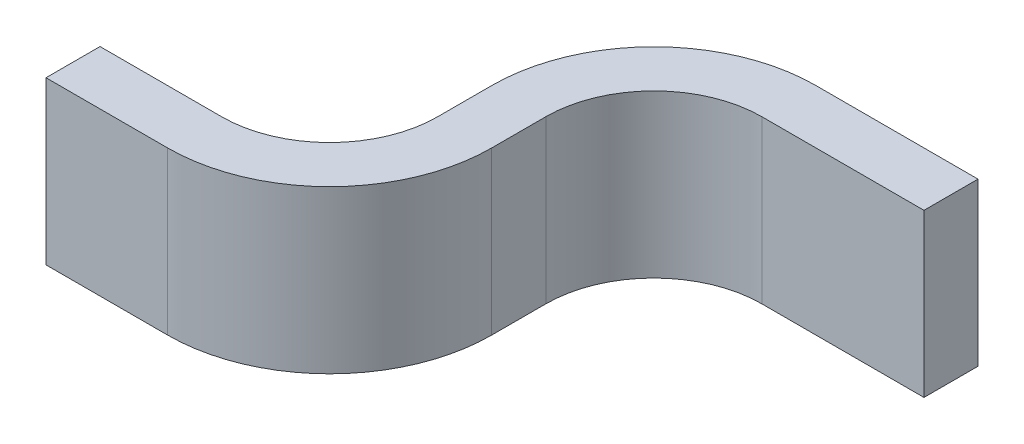
ISO-10303-21;
HEADER;
FILE_DESCRIPTION(('STEP AP214'),'2;1');
FILE_NAME('part.step','',(''),(''),'','','');
FILE_SCHEMA(('AUTOMOTIVE_DESIGN { 1 0 10303 214 1 1 1 1 }'));
ENDSEC;
DATA;
#1=APPLICATION_CONTEXT('core data for automotive mechanical design processes');
#2=APPLICATION_PROTOCOL_DEFINITION('international standard','automotive_design',2000,#1);
#3=PRODUCT_CONTEXT('',#1,'mechanical');
#4=PRODUCT('Part','Part','',(#3));
#5=PRODUCT_RELATED_PRODUCT_CATEGORY('part','',(#4));
#6=PRODUCT_DEFINITION_FORMATION('','',#4);
#7=PRODUCT_DEFINITION_CONTEXT('part definition',#1,'design');
#8=PRODUCT_DEFINITION('design','',#6,#7);
#9=PRODUCT_DEFINITION_SHAPE('','',#8);
#10=(LENGTH_UNIT() NAMED_UNIT(*) SI_UNIT(.MILLI.,.METRE.));
#11=(NAMED_UNIT(*) PLANE_ANGLE_UNIT() SI_UNIT($,.RADIAN.));
#12=(NAMED_UNIT(*) SI_UNIT($,.STERADIAN.) SOLID_ANGLE_UNIT());
#13=UNCERTAINTY_MEASURE_WITH_UNIT(LENGTH_MEASURE(1.E-05),#10,'distance_accuracy_value','');
#14=(GEOMETRIC_REPRESENTATION_CONTEXT(3) GLOBAL_UNCERTAINTY_ASSIGNED_CONTEXT((#13)) GLOBAL_UNIT_ASSIGNED_CONTEXT((#10,
#11,#12)) REPRESENTATION_CONTEXT('',''));
#15=CARTESIAN_POINT('',(0.,0.,0.));
#16=DIRECTION('',(0.,0.,1.));
#17=DIRECTION('',(1.,0.,0.));
#18=AXIS2_PLACEMENT_3D('',#15,#16,#17);
#19=CARTESIAN_POINT('',(15.475,57.010000024,2.313254));
#20=DIRECTION('',(-1.,0.,0.));
#21=DIRECTION('',(0.,-1.,0.));
#22=AXIS2_PLACEMENT_3D('',#19,#20,#21);
#23=PLANE('',#22);
#24=DIRECTION('',(0.,0.,1.));
#25=VECTOR('',#24,1.);
#26=CARTESIAN_POINT('',(15.475,64.385000024,2.713254));
#27=LINE('',#26,#25);
#28=CARTESIAN_POINT('',(15.475,64.385000024,2.413254));
#29=VERTEX_POINT('',#28);
#30=CARTESIAN_POINT('',(15.475,64.385000024,2.313254));
#31=VERTEX_POINT('',#30);
#32=EDGE_CURVE('E139',#29,#31,#27,.F.);
#33=ORIENTED_EDGE('',*,*,#32,.T.);
#34=DIRECTION('',(0.,-1.,0.));
#35=VECTOR('',#34,1.);
#36=CARTESIAN_POINT('',(15.475,57.010000024,2.313254));
#37=LINE('',#36,#35);
#38=CARTESIAN_POINT('',(15.475,64.685000024,2.313254));
#39=VERTEX_POINT('',#38);
#40=EDGE_CURVE('E153',#31,#39,#37,.F.);
#41=ORIENTED_EDGE('',*,*,#40,.T.);
#42=DIRECTION('',(0.,0.,1.));
#43=VECTOR('',#42,1.);
#44=CARTESIAN_POINT('',(15.475,64.685000024,2.713254));
#45=LINE('',#44,#43);
#46=CARTESIAN_POINT('',(15.475,64.685000024,2.413254));
#47=VERTEX_POINT('',#46);
#48=EDGE_CURVE('E207',#39,#47,#45,.T.);
#49=ORIENTED_EDGE('',*,*,#48,.T.);
#50=DIRECTION('',(0.,-1.,0.));
#51=VECTOR('',#50,1.);
#52=CARTESIAN_POINT('',(15.475,57.010000024,2.413254));
#53=LINE('',#52,#51);
#54=EDGE_CURVE('E187',#29,#47,#53,.F.);
#55=ORIENTED_EDGE('',*,*,#54,.F.);
#56=EDGE_LOOP('',(#33,#41,#49,#55));
#57=FACE_BOUND('',#56,.T.);
#58=ADVANCED_FACE('F17',(#57),#23,.F.);
#59=CARTESIAN_POINT('',(15.175,57.010000024,2.413254));
#60=DIRECTION('',(0.,-1.,0.));
#61=DIRECTION('',(1.,0.,0.));
#62=AXIS2_PLACEMENT_3D('',#59,#60,#61);
#63=CYLINDRICAL_SURFACE('',#62,0.3);
#64=ORIENTED_EDGE('',*,*,#54,.T.);
#65=CARTESIAN_POINT('',(15.175,64.685000024,2.413254));
#66=DIRECTION('',(0.,-1.,0.));
#67=DIRECTION('',(1.,0.,0.));
#68=AXIS2_PLACEMENT_3D('',#65,#66,#67);
#69=CIRCLE('',#68,0.3);
#70=CARTESIAN_POINT('',(15.175,64.685000024,2.713254));
#71=VERTEX_POINT('',#70);
#72=EDGE_CURVE('E205',#47,#71,#69,.T.);
#73=ORIENTED_EDGE('',*,*,#72,.T.);
#74=DIRECTION('',(0.,1.,0.));
#75=VECTOR('',#74,1.);
#76=CARTESIAN_POINT('',(15.175,64.685000024,2.713254));
#77=LINE('',#76,#75);
#78=CARTESIAN_POINT('',(15.175,64.385000024,2.713254));
#79=VERTEX_POINT('',#78);
#80=EDGE_CURVE('E122',#71,#79,#77,.F.);
#81=ORIENTED_EDGE('',*,*,#80,.T.);
#82=CARTESIAN_POINT('',(15.175,64.385000024,2.413254));
#83=DIRECTION('',(0.,-1.,0.));
#84=DIRECTION('',(1.,0.,0.));
#85=AXIS2_PLACEMENT_3D('',#82,#83,#84);
#86=CIRCLE('',#85,0.3);
#87=EDGE_CURVE('E137',#79,#29,#86,.F.);
#88=ORIENTED_EDGE('',*,*,#87,.T.);
#89=EDGE_LOOP('',(#64,#73,#81,#88));
#90=FACE_BOUND('',#89,.T.);
#91=ADVANCED_FACE('F362',(#90),#63,.T.);
#92=CARTESIAN_POINT('',(15.975,64.685000024,2.713254));
#93=DIRECTION('',(0.,0.,-1.));
#94=DIRECTION('',(-1.,0.,0.));
#95=AXIS2_PLACEMENT_3D('',#92,#93,#94);
#96=PLANE('',#95);
#97=DIRECTION('',(1.,0.,0.));
#98=VECTOR('',#97,1.);
#99=CARTESIAN_POINT('',(14.95,64.685000024,2.713254));
#100=LINE('',#99,#98);
#101=CARTESIAN_POINT('',(14.95,64.685000024,2.713254));
#102=VERTEX_POINT('',#101);
#103=EDGE_CURVE('E118',#71,#102,#100,.F.);
#104=ORIENTED_EDGE('',*,*,#103,.T.);
#105=DIRECTION('',(0.,1.,0.));
#106=VECTOR('',#105,1.);
#107=CARTESIAN_POINT('',(14.95,64.685000024,2.713254));
#108=LINE('',#107,#106);
#109=CARTESIAN_POINT('',(14.95,64.385000024,2.713254));
#110=VERTEX_POINT('',#109);
#111=EDGE_CURVE('E110',#102,#110,#108,.F.);
#112=ORIENTED_EDGE('',*,*,#111,.T.);
#113=DIRECTION('',(-1.,0.,0.));
#114=VECTOR('',#113,1.);
#115=CARTESIAN_POINT('',(14.95,64.385000024,2.713254));
#116=LINE('',#115,#114);
#117=EDGE_CURVE('E115',#110,#79,#116,.F.);
#118=ORIENTED_EDGE('',*,*,#117,.T.);
#119=ORIENTED_EDGE('',*,*,#80,.F.);
#120=EDGE_LOOP('',(#104,#112,#118,#119));
#121=FACE_BOUND('',#120,.T.);
#122=ADVANCED_FACE('F112',(#121),#96,.F.);
#123=CARTESIAN_POINT('',(14.95,64.685000024,2.713254));
#124=DIRECTION('',(1.,0.,0.));
#125=DIRECTION('',(0.,1.,0.));
#126=AXIS2_PLACEMENT_3D('',#123,#124,#125);
#127=PLANE('',#126);
#128=DIRECTION('',(0.,1.,0.));
#129=VECTOR('',#128,1.);
#130=CARTESIAN_POINT('',(14.95,57.010000024,2.613254));
#131=LINE('',#130,#129);
#132=CARTESIAN_POINT('',(14.95,64.685000024,2.613254));
#133=VERTEX_POINT('',#132);
#134=CARTESIAN_POINT('',(14.95,64.385000024,2.613254));
#135=VERTEX_POINT('',#134);
#136=EDGE_CURVE('E121',#133,#135,#131,.F.);
#137=ORIENTED_EDGE('',*,*,#136,.T.);
#138=DIRECTION('',(0.,0.,1.));
#139=VECTOR('',#138,1.);
#140=CARTESIAN_POINT('',(14.95,64.385000024,2.713254));
#141=LINE('',#140,#139);
#142=EDGE_CURVE('E125',#135,#110,#141,.T.);
#143=ORIENTED_EDGE('',*,*,#142,.T.);
#144=ORIENTED_EDGE('',*,*,#111,.F.);
#145=DIRECTION('',(0.,0.,1.));
#146=VECTOR('',#145,1.);
#147=CARTESIAN_POINT('',(14.95,64.685000024,2.713254));
#148=LINE('',#147,#146);
#149=EDGE_CURVE('E179',#102,#133,#148,.F.);
#150=ORIENTED_EDGE('',*,*,#149,.T.);
#151=EDGE_LOOP('',(#137,#143,#144,#150));
#152=FACE_BOUND('',#151,.T.);
#153=ADVANCED_FACE('F126',(#152),#127,.F.);
#154=CARTESIAN_POINT('',(15.175,57.010000024,2.613254));
#155=DIRECTION('',(0.,0.,1.));
#156=DIRECTION('',(1.,0.,0.));
#157=AXIS2_PLACEMENT_3D('',#154,#155,#156);
#158=PLANE('',#157);
#159=DIRECTION('',(-1.,0.,0.));
#160=VECTOR('',#159,1.);
#161=CARTESIAN_POINT('',(14.95,64.385000024,2.613254));
#162=LINE('',#161,#160);
#163=CARTESIAN_POINT('',(15.175,64.385000024,2.613254));
#164=VERTEX_POINT('',#163);
#165=EDGE_CURVE('E131',#164,#135,#162,.T.);
#166=ORIENTED_EDGE('',*,*,#165,.T.);
#167=ORIENTED_EDGE('',*,*,#136,.F.);
#168=DIRECTION('',(1.,0.,0.));
#169=VECTOR('',#168,1.);
#170=CARTESIAN_POINT('',(14.95,64.685000024,2.613254));
#171=LINE('',#170,#169);
#172=CARTESIAN_POINT('',(15.175,64.685000024,2.613254));
#173=VERTEX_POINT('',#172);
#174=EDGE_CURVE('E181',#133,#173,#171,.T.);
#175=ORIENTED_EDGE('',*,*,#174,.T.);
#176=DIRECTION('',(0.,-1.,0.));
#177=VECTOR('',#176,1.);
#178=CARTESIAN_POINT('',(15.175,57.010000024,2.613254));
#179=LINE('',#178,#177);
#180=EDGE_CURVE('E158',#173,#164,#179,.T.);
#181=ORIENTED_EDGE('',*,*,#180,.T.);
#182=EDGE_LOOP('',(#166,#167,#175,#181));
#183=FACE_BOUND('',#182,.T.);
#184=ADVANCED_FACE('F258',(#183),#158,.F.);
#185=CARTESIAN_POINT('',(15.175,57.010000024,2.413254));
#186=DIRECTION('',(0.,-1.,0.));
#187=DIRECTION('',(1.,0.,0.));
#188=AXIS2_PLACEMENT_3D('',#185,#186,#187);
#189=CYLINDRICAL_SURFACE('',#188,0.2);
#190=CARTESIAN_POINT('',(15.175,64.385000024,2.413254));
#191=DIRECTION('',(0.,-1.,0.));
#192=DIRECTION('',(1.,0.,0.));
#193=AXIS2_PLACEMENT_3D('',#190,#191,#192);
#194=CIRCLE('',#193,0.2);
#195=CARTESIAN_POINT('',(15.375,64.385000024,2.41325399999999));
#196=VERTEX_POINT('',#195);
#197=EDGE_CURVE('E20',#196,#164,#194,.T.);
#198=ORIENTED_EDGE('',*,*,#197,.T.);
#199=ORIENTED_EDGE('',*,*,#180,.F.);
#200=CARTESIAN_POINT('',(15.175,64.685000024,2.413254));
#201=DIRECTION('',(0.,-1.,0.));
#202=DIRECTION('',(1.,0.,0.));
#203=AXIS2_PLACEMENT_3D('',#200,#201,#202);
#204=CIRCLE('',#203,0.2);
#205=CARTESIAN_POINT('',(15.375,64.685000024,2.41325399999999));
#206=VERTEX_POINT('',#205);
#207=EDGE_CURVE('E203',#173,#206,#204,.F.);
#208=ORIENTED_EDGE('',*,*,#207,.T.);
#209=DIRECTION('',(0.,1.,0.));
#210=VECTOR('',#209,1.);
#211=CARTESIAN_POINT('',(15.375,57.010000024,2.41325399999999));
#212=LINE('',#211,#210);
#213=EDGE_CURVE('E87',#206,#196,#212,.F.);
#214=ORIENTED_EDGE('',*,*,#213,.T.);
#215=EDGE_LOOP('',(#198,#199,#208,#214));
#216=FACE_BOUND('',#215,.T.);
#217=ADVANCED_FACE('F260',(#216),#189,.F.);
#218=CARTESIAN_POINT('',(15.975,64.685000024,2.713254));
#219=DIRECTION('',(-1.,0.,0.));
#220=DIRECTION('',(0.,-1.,0.));
#221=AXIS2_PLACEMENT_3D('',#218,#219,#220);
#222=PLANE('',#221);
#223=DIRECTION('',(0.,1.,0.));
#224=VECTOR('',#223,1.);
#225=CARTESIAN_POINT('',(15.975,57.010000024,2.113254));
#226=LINE('',#225,#224);
#227=CARTESIAN_POINT('',(15.975,64.685000024,2.113254));
#228=VERTEX_POINT('',#227);
#229=CARTESIAN_POINT('',(15.975,64.385000024,2.113254));
#230=VERTEX_POINT('',#229);
#231=EDGE_CURVE('E95',#228,#230,#226,.F.);
#232=ORIENTED_EDGE('',*,*,#231,.T.);
#233=DIRECTION('',(0.,0.,1.));
#234=VECTOR('',#233,1.);
#235=CARTESIAN_POINT('',(15.975,64.385000024,2.713254));
#236=LINE('',#235,#234);
#237=CARTESIAN_POINT('',(15.975,64.385000024,2.013254));
#238=VERTEX_POINT('',#237);
#239=EDGE_CURVE('E173',#230,#238,#236,.F.);
#240=ORIENTED_EDGE('',*,*,#239,.T.);
#241=DIRECTION('',(0.,1.,0.));
#242=VECTOR('',#241,1.);
#243=CARTESIAN_POINT('',(15.975,64.685000024,2.013254));
#244=LINE('',#243,#242);
#245=CARTESIAN_POINT('',(15.975,64.685000024,2.013254));
#246=VERTEX_POINT('',#245);
#247=EDGE_CURVE('E150',#246,#238,#244,.F.);
#248=ORIENTED_EDGE('',*,*,#247,.F.);
#249=DIRECTION('',(0.,0.,1.));
#250=VECTOR('',#249,1.);
#251=CARTESIAN_POINT('',(15.975,64.685000024,2.713254));
#252=LINE('',#251,#250);
#253=EDGE_CURVE('E161',#246,#228,#252,.T.);
#254=ORIENTED_EDGE('',*,*,#253,.T.);
#255=EDGE_LOOP('',(#232,#240,#248,#254));
#256=FACE_BOUND('',#255,.T.);
#257=ADVANCED_FACE('F321',(#256),#222,.F.);
#258=CARTESIAN_POINT('',(15.675,57.010000024,2.113254));
#259=DIRECTION('',(0.,0.,-1.));
#260=DIRECTION('',(-1.,0.,0.));
#261=AXIS2_PLACEMENT_3D('',#258,#259,#260);
#262=PLANE('',#261);
#263=DIRECTION('',(-1.,0.,0.));
#264=VECTOR('',#263,1.);
#265=CARTESIAN_POINT('',(14.95,64.385000024,2.113254));
#266=LINE('',#265,#264);
#267=CARTESIAN_POINT('',(15.675,64.385000024,2.113254));
#268=VERTEX_POINT('',#267);
#269=EDGE_CURVE('E191',#268,#230,#266,.F.);
#270=ORIENTED_EDGE('',*,*,#269,.T.);
#271=ORIENTED_EDGE('',*,*,#231,.F.);
#272=DIRECTION('',(1.,0.,0.));
#273=VECTOR('',#272,1.);
#274=CARTESIAN_POINT('',(14.95,64.685000024,2.113254));
#275=LINE('',#274,#273);
#276=CARTESIAN_POINT('',(15.675,64.685000024,2.113254));
#277=VERTEX_POINT('',#276);
#278=EDGE_CURVE('E163',#228,#277,#275,.F.);
#279=ORIENTED_EDGE('',*,*,#278,.T.);
#280=DIRECTION('',(0.,-1.,0.));
#281=VECTOR('',#280,1.);
#282=CARTESIAN_POINT('',(15.675,57.010000024,2.113254));
#283=LINE('',#282,#281);
#284=EDGE_CURVE('E155',#277,#268,#283,.T.);
#285=ORIENTED_EDGE('',*,*,#284,.T.);
#286=EDGE_LOOP('',(#270,#271,#279,#285));
#287=FACE_BOUND('',#286,.T.);
#288=ADVANCED_FACE('F222',(#287),#262,.F.);
#289=CARTESIAN_POINT('',(15.675,57.010000024,2.313254));
#290=DIRECTION('',(0.,-1.,0.));
#291=DIRECTION('',(1.,0.,0.));
#292=AXIS2_PLACEMENT_3D('',#289,#290,#291);
#293=CYLINDRICAL_SURFACE('',#292,0.2);
#294=CARTESIAN_POINT('',(15.675,64.385000024,2.313254));
#295=DIRECTION('',(0.,-1.,0.));
#296=DIRECTION('',(1.,0.,0.));
#297=AXIS2_PLACEMENT_3D('',#294,#295,#296);
#298=CIRCLE('',#297,0.2);
#299=EDGE_CURVE('E208',#31,#268,#298,.T.);
#300=ORIENTED_EDGE('',*,*,#299,.T.);
#301=ORIENTED_EDGE('',*,*,#284,.F.);
#302=CARTESIAN_POINT('',(15.675,64.685000024,2.313254));
#303=DIRECTION('',(0.,-1.,0.));
#304=DIRECTION('',(1.,0.,0.));
#305=AXIS2_PLACEMENT_3D('',#302,#303,#304);
#306=CIRCLE('',#305,0.2);
#307=EDGE_CURVE('E200',#277,#39,#306,.F.);
#308=ORIENTED_EDGE('',*,*,#307,.T.);
#309=ORIENTED_EDGE('',*,*,#40,.F.);
#310=EDGE_LOOP('',(#300,#301,#308,#309));
#311=FACE_BOUND('',#310,.T.);
#312=ADVANCED_FACE('F216',(#311),#293,.F.);
#313=CARTESIAN_POINT('',(15.975,64.685000024,2.013254));
#314=DIRECTION('',(0.,0.,-1.));
#315=DIRECTION('',(-1.,0.,0.));
#316=AXIS2_PLACEMENT_3D('',#313,#314,#315);
#317=PLANE('',#316);
#318=ORIENTED_EDGE('',*,*,#247,.T.);
#319=DIRECTION('',(-1.,0.,0.));
#320=VECTOR('',#319,1.);
#321=CARTESIAN_POINT('',(14.95,64.385000024,2.013254));
#322=LINE('',#321,#320);
#323=CARTESIAN_POINT('',(15.675,64.385000024,2.013254));
#324=VERTEX_POINT('',#323);
#325=EDGE_CURVE('E148',#238,#324,#322,.T.);
#326=ORIENTED_EDGE('',*,*,#325,.T.);
#327=DIRECTION('',(0.,-1.,0.));
#328=VECTOR('',#327,1.);
#329=CARTESIAN_POINT('',(15.675,57.010000024,2.013254));
#330=LINE('',#329,#328);
#331=CARTESIAN_POINT('',(15.675,64.685000024,2.013254));
#332=VERTEX_POINT('',#331);
#333=EDGE_CURVE('E199',#332,#324,#330,.T.);
#334=ORIENTED_EDGE('',*,*,#333,.F.);
#335=DIRECTION('',(1.,0.,0.));
#336=VECTOR('',#335,1.);
#337=CARTESIAN_POINT('',(14.95,64.685000024,2.013254));
#338=LINE('',#337,#336);
#339=EDGE_CURVE('E164',#332,#246,#338,.T.);
#340=ORIENTED_EDGE('',*,*,#339,.T.);
#341=EDGE_LOOP('',(#318,#326,#334,#340));
#342=FACE_BOUND('',#341,.T.);
#343=ADVANCED_FACE('F244',(#342),#317,.T.);
#344=CARTESIAN_POINT('',(14.95,64.385000024,2.713254));
#345=DIRECTION('',(0.,1.,0.));
#346=DIRECTION('',(-1.,0.,0.));
#347=AXIS2_PLACEMENT_3D('',#344,#345,#346);
#348=PLANE('',#347);
#349=ORIENTED_EDGE('',*,*,#269,.F.);
#350=ORIENTED_EDGE('',*,*,#299,.F.);
#351=ORIENTED_EDGE('',*,*,#32,.F.);
#352=ORIENTED_EDGE('',*,*,#87,.F.);
#353=ORIENTED_EDGE('',*,*,#117,.F.);
#354=ORIENTED_EDGE('',*,*,#142,.F.);
#355=ORIENTED_EDGE('',*,*,#165,.F.);
#356=ORIENTED_EDGE('',*,*,#197,.F.);
#357=DIRECTION('',(0.,0.,1.));
#358=VECTOR('',#357,1.);
#359=CARTESIAN_POINT('',(15.375,64.385000024,2.313254));
#360=LINE('',#359,#358);
#361=CARTESIAN_POINT('',(15.375,64.385000024,2.313254));
#362=VERTEX_POINT('',#361);
#363=EDGE_CURVE('E172',#196,#362,#360,.F.);
#364=ORIENTED_EDGE('',*,*,#363,.T.);
#365=CARTESIAN_POINT('',(15.675,64.385000024,2.313254));
#366=DIRECTION('',(0.,-1.,0.));
#367=DIRECTION('',(1.,0.,0.));
#368=AXIS2_PLACEMENT_3D('',#365,#366,#367);
#369=CIRCLE('',#368,0.300000000000002);
#370=EDGE_CURVE('E196',#324,#362,#369,.F.);
#371=ORIENTED_EDGE('',*,*,#370,.F.);
#372=ORIENTED_EDGE('',*,*,#325,.F.);
#373=ORIENTED_EDGE('',*,*,#239,.F.);
#374=EDGE_LOOP('',(#349,#350,#351,#352,#353,#354,#355,#356,#364,#371,#372,#373));
#375=FACE_BOUND('',#374,.T.);
#376=ADVANCED_FACE('F134',(#375),#348,.F.);
#377=CARTESIAN_POINT('',(15.375,57.010000024,2.313254));
#378=DIRECTION('',(1.,0.,0.));
#379=DIRECTION('',(0.,1.,0.));
#380=AXIS2_PLACEMENT_3D('',#377,#378,#379);
#381=PLANE('',#380);
#382=ORIENTED_EDGE('',*,*,#363,.F.);
#383=ORIENTED_EDGE('',*,*,#213,.F.);
#384=DIRECTION('',(0.,0.,1.));
#385=VECTOR('',#384,1.);
#386=CARTESIAN_POINT('',(15.375,64.685000024,2.713254));
#387=LINE('',#386,#385);
#388=CARTESIAN_POINT('',(15.375,64.685000024,2.313254));
#389=VERTEX_POINT('',#388);
#390=EDGE_CURVE('E35',#206,#389,#387,.F.);
#391=ORIENTED_EDGE('',*,*,#390,.T.);
#392=DIRECTION('',(0.,-1.,0.));
#393=VECTOR('',#392,1.);
#394=CARTESIAN_POINT('',(15.375,57.010000024,2.313254));
#395=LINE('',#394,#393);
#396=EDGE_CURVE('E26',#362,#389,#395,.F.);
#397=ORIENTED_EDGE('',*,*,#396,.F.);
#398=EDGE_LOOP('',(#382,#383,#391,#397));
#399=FACE_BOUND('',#398,.T.);
#400=ADVANCED_FACE('F263',(#399),#381,.F.);
#401=CARTESIAN_POINT('',(14.95,64.685000024,2.713254));
#402=DIRECTION('',(0.,-1.,0.));
#403=DIRECTION('',(1.,0.,0.));
#404=AXIS2_PLACEMENT_3D('',#401,#402,#403);
#405=PLANE('',#404);
#406=ORIENTED_EDGE('',*,*,#278,.F.);
#407=ORIENTED_EDGE('',*,*,#253,.F.);
#408=ORIENTED_EDGE('',*,*,#339,.F.);
#409=CARTESIAN_POINT('',(15.675,64.685000024,2.313254));
#410=DIRECTION('',(0.,-1.,0.));
#411=DIRECTION('',(1.,0.,0.));
#412=AXIS2_PLACEMENT_3D('',#409,#410,#411);
#413=CIRCLE('',#412,0.300000000000002);
#414=EDGE_CURVE('E11',#389,#332,#413,.T.);
#415=ORIENTED_EDGE('',*,*,#414,.F.);
#416=ORIENTED_EDGE('',*,*,#390,.F.);
#417=ORIENTED_EDGE('',*,*,#207,.F.);
#418=ORIENTED_EDGE('',*,*,#174,.F.);
#419=ORIENTED_EDGE('',*,*,#149,.F.);
#420=ORIENTED_EDGE('',*,*,#103,.F.);
#421=ORIENTED_EDGE('',*,*,#72,.F.);
#422=ORIENTED_EDGE('',*,*,#48,.F.);
#423=ORIENTED_EDGE('',*,*,#307,.F.);
#424=EDGE_LOOP('',(#406,#407,#408,#415,#416,#417,#418,#419,#420,#421,#422,#423));
#425=FACE_BOUND('',#424,.T.);
#426=ADVANCED_FACE('F225',(#425),#405,.F.);
#427=CARTESIAN_POINT('',(15.675,57.010000024,2.313254));
#428=DIRECTION('',(0.,-1.,0.));
#429=DIRECTION('',(1.,0.,0.));
#430=AXIS2_PLACEMENT_3D('',#427,#428,#429);
#431=CYLINDRICAL_SURFACE('',#430,0.300000000000002);
#432=ORIENTED_EDGE('',*,*,#396,.T.);
#433=ORIENTED_EDGE('',*,*,#414,.T.);
#434=ORIENTED_EDGE('',*,*,#333,.T.);
#435=ORIENTED_EDGE('',*,*,#370,.T.);
#436=EDGE_LOOP('',(#432,#433,#434,#435));
#437=FACE_BOUND('',#436,.T.);
#438=ADVANCED_FACE('F239',(#437),#431,.T.);
#439=CLOSED_SHELL('',(#58,#91,#122,#153,#184,#217,#257,#288,#312,#343,#376,#400,#426,#438));
#440=MANIFOLD_SOLID_BREP('B1',#439);
#441=ADVANCED_BREP_SHAPE_REPRESENTATION('',(#18,#440),#14);
#442=SHAPE_DEFINITION_REPRESENTATION(#9,#441);
ENDSEC;
END-ISO-10303-21;
